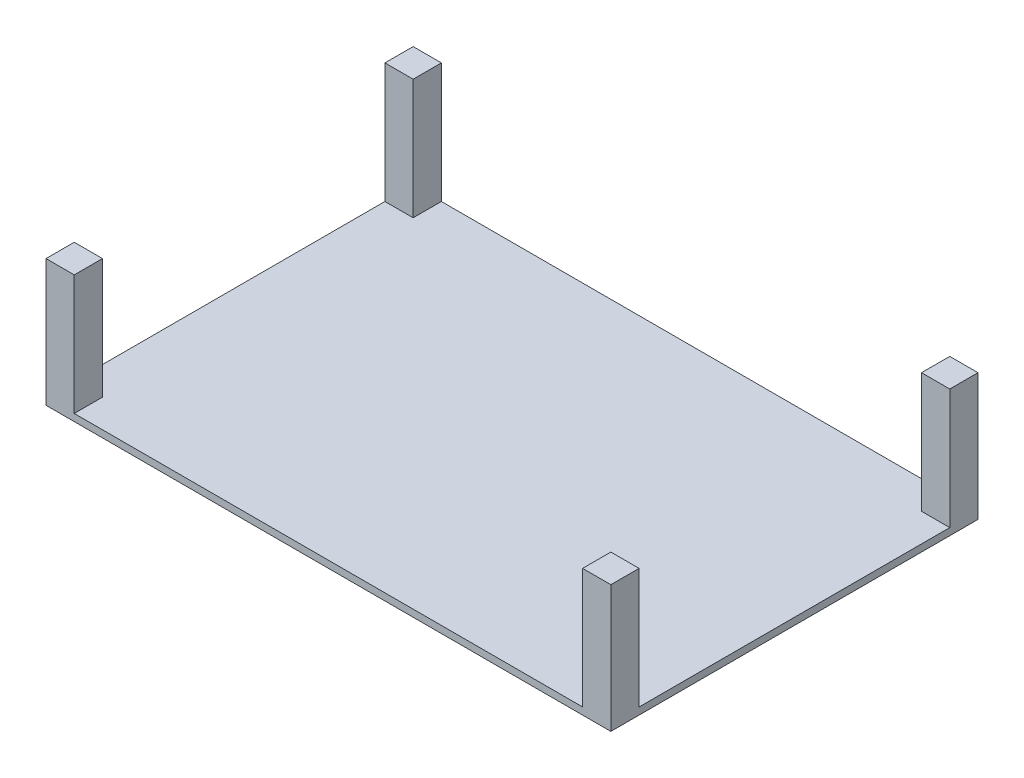
ISO-10303-21;
HEADER;
FILE_DESCRIPTION(('STEP AP214'),'2;1');
FILE_NAME('part.step','',(''),(''),'','','');
FILE_SCHEMA(('AUTOMOTIVE_DESIGN { 1 0 10303 214 1 1 1 1 }'));
ENDSEC;
DATA;
#1=APPLICATION_CONTEXT('core data for automotive mechanical design processes');
#2=APPLICATION_PROTOCOL_DEFINITION('international standard','automotive_design',2000,#1);
#3=PRODUCT_CONTEXT('',#1,'mechanical');
#4=PRODUCT('Part','Part','',(#3));
#5=PRODUCT_RELATED_PRODUCT_CATEGORY('part','',(#4));
#6=PRODUCT_DEFINITION_FORMATION('','',#4);
#7=PRODUCT_DEFINITION_CONTEXT('part definition',#1,'design');
#8=PRODUCT_DEFINITION('design','',#6,#7);
#9=PRODUCT_DEFINITION_SHAPE('','',#8);
#10=(LENGTH_UNIT() NAMED_UNIT(*) SI_UNIT(.MILLI.,.METRE.));
#11=(NAMED_UNIT(*) PLANE_ANGLE_UNIT() SI_UNIT($,.RADIAN.));
#12=(NAMED_UNIT(*) SI_UNIT($,.STERADIAN.) SOLID_ANGLE_UNIT());
#13=UNCERTAINTY_MEASURE_WITH_UNIT(LENGTH_MEASURE(1.E-05),#10,'distance_accuracy_value','');
#14=(GEOMETRIC_REPRESENTATION_CONTEXT(3) GLOBAL_UNCERTAINTY_ASSIGNED_CONTEXT((#13)) GLOBAL_UNIT_ASSIGNED_CONTEXT((#10,
#11,#12)) REPRESENTATION_CONTEXT('',''));
#15=CARTESIAN_POINT('',(0.,0.,0.));
#16=DIRECTION('',(0.,0.,1.));
#17=DIRECTION('',(1.,0.,0.));
#18=AXIS2_PLACEMENT_3D('',#15,#16,#17);
#19=CARTESIAN_POINT('',(0.,3.175,0.));
#20=DIRECTION('',(0.,-1.,0.));
#21=DIRECTION('',(0.,0.,-1.));
#22=AXIS2_PLACEMENT_3D('',#19,#20,#21);
#23=PLANE('',#22);
#24=DIRECTION('',(0.,0.,1.));
#25=VECTOR('',#24,1.);
#26=CARTESIAN_POINT('',(114.299999999999,3.175,-69.8499999999999));
#27=LINE('',#26,#25);
#28=CARTESIAN_POINT('',(114.299999999999,3.175,-82.5499999999999));
#29=VERTEX_POINT('',#28);
#30=CARTESIAN_POINT('',(114.299999999999,3.175,-69.8499999999999));
#31=VERTEX_POINT('',#30);
#32=EDGE_CURVE('E184',#29,#31,#27,.T.);
#33=ORIENTED_EDGE('',*,*,#32,.F.);
#34=DIRECTION('',(-1.,0.,0.));
#35=VECTOR('',#34,1.);
#36=CARTESIAN_POINT('',(-127.,3.175,-82.55));
#37=LINE('',#36,#35);
#38=CARTESIAN_POINT('',(-114.3,3.175,-82.55));
#39=VERTEX_POINT('',#38);
#40=EDGE_CURVE('E296',#29,#39,#37,.T.);
#41=ORIENTED_EDGE('',*,*,#40,.T.);
#42=DIRECTION('',(0.,0.,-1.));
#43=VECTOR('',#42,1.);
#44=CARTESIAN_POINT('',(-114.3,3.175,-69.8499999999999));
#45=LINE('',#44,#43);
#46=CARTESIAN_POINT('',(-114.3,3.175,-69.8499999999999));
#47=VERTEX_POINT('',#46);
#48=EDGE_CURVE('E191',#47,#39,#45,.T.);
#49=ORIENTED_EDGE('',*,*,#48,.F.);
#50=DIRECTION('',(1.,0.,0.));
#51=VECTOR('',#50,1.);
#52=CARTESIAN_POINT('',(-127.,3.175,-69.8499999999999));
#53=LINE('',#52,#51);
#54=CARTESIAN_POINT('',(-127.,3.175,-69.8499999999999));
#55=VERTEX_POINT('',#54);
#56=EDGE_CURVE('E186',#55,#47,#53,.T.);
#57=ORIENTED_EDGE('',*,*,#56,.F.);
#58=DIRECTION('',(0.,0.,1.));
#59=VECTOR('',#58,1.);
#60=CARTESIAN_POINT('',(-127.,3.175,82.55));
#61=LINE('',#60,#59);
#62=CARTESIAN_POINT('',(-127.,3.175,69.85));
#63=VERTEX_POINT('',#62);
#64=EDGE_CURVE('E300',#55,#63,#61,.T.);
#65=ORIENTED_EDGE('',*,*,#64,.T.);
#66=DIRECTION('',(-1.,0.,0.));
#67=VECTOR('',#66,1.);
#68=CARTESIAN_POINT('',(-127.,3.175,69.85));
#69=LINE('',#68,#67);
#70=CARTESIAN_POINT('',(-114.3,3.175,69.85));
#71=VERTEX_POINT('',#70);
#72=EDGE_CURVE('E266',#71,#63,#69,.T.);
#73=ORIENTED_EDGE('',*,*,#72,.F.);
#74=DIRECTION('',(0.,0.,-1.));
#75=VECTOR('',#74,1.);
#76=CARTESIAN_POINT('',(-114.3,3.175,82.55));
#77=LINE('',#76,#75);
#78=CARTESIAN_POINT('',(-114.3,3.175,82.55));
#79=VERTEX_POINT('',#78);
#80=EDGE_CURVE('E260',#79,#71,#77,.T.);
#81=ORIENTED_EDGE('',*,*,#80,.F.);
#82=DIRECTION('',(1.,0.,0.));
#83=VECTOR('',#82,1.);
#84=CARTESIAN_POINT('',(-127.,3.175,82.55));
#85=LINE('',#84,#83);
#86=CARTESIAN_POINT('',(114.299999999999,3.175,82.55));
#87=VERTEX_POINT('',#86);
#88=EDGE_CURVE('E303',#79,#87,#85,.T.);
#89=ORIENTED_EDGE('',*,*,#88,.T.);
#90=DIRECTION('',(0.,0.,1.));
#91=VECTOR('',#90,1.);
#92=CARTESIAN_POINT('',(114.299999999999,3.175,82.55));
#93=LINE('',#92,#91);
#94=CARTESIAN_POINT('',(114.299999999999,3.175,69.85));
#95=VERTEX_POINT('',#94);
#96=EDGE_CURVE('E226',#95,#87,#93,.T.);
#97=ORIENTED_EDGE('',*,*,#96,.F.);
#98=DIRECTION('',(-1.,0.,0.));
#99=VECTOR('',#98,1.);
#100=CARTESIAN_POINT('',(114.299999999999,3.175,69.85));
#101=LINE('',#100,#99);
#102=CARTESIAN_POINT('',(127.,3.175,69.85));
#103=VERTEX_POINT('',#102);
#104=EDGE_CURVE('E232',#103,#95,#101,.T.);
#105=ORIENTED_EDGE('',*,*,#104,.F.);
#106=DIRECTION('',(0.,0.,-1.));
#107=VECTOR('',#106,1.);
#108=CARTESIAN_POINT('',(127.,3.175,82.55));
#109=LINE('',#108,#107);
#110=CARTESIAN_POINT('',(127.,3.175,-69.8499999999999));
#111=VERTEX_POINT('',#110);
#112=EDGE_CURVE('E68',#103,#111,#109,.T.);
#113=ORIENTED_EDGE('',*,*,#112,.T.);
#114=DIRECTION('',(1.,0.,0.));
#115=VECTOR('',#114,1.);
#116=CARTESIAN_POINT('',(114.299999999999,3.175,-69.8499999999999));
#117=LINE('',#116,#115);
#118=EDGE_CURVE('E63',#31,#111,#117,.T.);
#119=ORIENTED_EDGE('',*,*,#118,.F.);
#120=EDGE_LOOP('',(#33,#41,#49,#57,#65,#73,#81,#89,#97,#105,#113,#119));
#121=FACE_BOUND('',#120,.T.);
#122=ADVANCED_FACE('F47',(#121),#23,.F.);
#123=CARTESIAN_POINT('',(127.,3.175,82.55));
#124=DIRECTION('',(-1.,0.,0.));
#125=DIRECTION('',(0.,0.,1.));
#126=AXIS2_PLACEMENT_3D('',#123,#124,#125);
#127=PLANE('',#126);
#128=DIRECTION('',(0.,0.,-1.));
#129=VECTOR('',#128,1.);
#130=CARTESIAN_POINT('',(127.,0.,82.55));
#131=LINE('',#130,#129);
#132=CARTESIAN_POINT('',(127.,0.,82.55));
#133=VERTEX_POINT('',#132);
#134=CARTESIAN_POINT('',(127.,0.,-82.55));
#135=VERTEX_POINT('',#134);
#136=EDGE_CURVE('E293',#133,#135,#131,.T.);
#137=ORIENTED_EDGE('',*,*,#136,.T.);
#138=DIRECTION('',(0.,-1.,0.));
#139=VECTOR('',#138,1.);
#140=CARTESIAN_POINT('',(127.,3.175,-82.55));
#141=LINE('',#140,#139);
#142=CARTESIAN_POINT('',(126.999999999999,57.15,-82.5499999999999));
#143=VERTEX_POINT('',#142);
#144=EDGE_CURVE('E11',#143,#135,#141,.T.);
#145=ORIENTED_EDGE('',*,*,#144,.F.);
#146=DIRECTION('',(0.,0.,-1.));
#147=VECTOR('',#146,1.);
#148=CARTESIAN_POINT('',(126.999999999999,57.15,-69.8499999999999));
#149=LINE('',#148,#147);
#150=CARTESIAN_POINT('',(126.999999999999,57.15,-69.8499999999999));
#151=VERTEX_POINT('',#150);
#152=EDGE_CURVE('E171',#151,#143,#149,.T.);
#153=ORIENTED_EDGE('',*,*,#152,.F.);
#154=DIRECTION('',(0.,-1.,0.));
#155=VECTOR('',#154,1.);
#156=CARTESIAN_POINT('',(126.999999999999,57.15,-69.8499999999999));
#157=LINE('',#156,#155);
#158=EDGE_CURVE('E166',#151,#111,#157,.T.);
#159=ORIENTED_EDGE('',*,*,#158,.T.);
#160=ORIENTED_EDGE('',*,*,#112,.F.);
#161=DIRECTION('',(0.,-1.,0.));
#162=VECTOR('',#161,1.);
#163=CARTESIAN_POINT('',(126.999999999999,57.15,69.85));
#164=LINE('',#163,#162);
#165=CARTESIAN_POINT('',(126.999999999999,57.15,69.85));
#166=VERTEX_POINT('',#165);
#167=EDGE_CURVE('E252',#166,#103,#164,.T.);
#168=ORIENTED_EDGE('',*,*,#167,.F.);
#169=DIRECTION('',(0.,0.,-1.));
#170=VECTOR('',#169,1.);
#171=CARTESIAN_POINT('',(126.999999999999,57.15,82.55));
#172=LINE('',#171,#170);
#173=CARTESIAN_POINT('',(126.999999999999,57.15,82.55));
#174=VERTEX_POINT('',#173);
#175=EDGE_CURVE('E236',#174,#166,#172,.T.);
#176=ORIENTED_EDGE('',*,*,#175,.F.);
#177=DIRECTION('',(0.,-1.,0.));
#178=VECTOR('',#177,1.);
#179=CARTESIAN_POINT('',(127.,3.175,82.55));
#180=LINE('',#179,#178);
#181=EDGE_CURVE('E306',#174,#133,#180,.T.);
#182=ORIENTED_EDGE('',*,*,#181,.T.);
#183=EDGE_LOOP('',(#137,#145,#153,#159,#160,#168,#176,#182));
#184=FACE_BOUND('',#183,.T.);
#185=ADVANCED_FACE('F49',(#184),#127,.F.);
#186=CARTESIAN_POINT('',(-127.,3.175,-82.55));
#187=DIRECTION('',(0.,0.,1.));
#188=DIRECTION('',(1.,0.,0.));
#189=AXIS2_PLACEMENT_3D('',#186,#187,#188);
#190=PLANE('',#189);
#191=DIRECTION('',(-1.,0.,0.));
#192=VECTOR('',#191,1.);
#193=CARTESIAN_POINT('',(-127.,0.,-82.55));
#194=LINE('',#193,#192);
#195=CARTESIAN_POINT('',(-127.,0.,-82.55));
#196=VERTEX_POINT('',#195);
#197=EDGE_CURVE('E310',#135,#196,#194,.T.);
#198=ORIENTED_EDGE('',*,*,#197,.T.);
#199=DIRECTION('',(0.,-1.,0.));
#200=VECTOR('',#199,1.);
#201=CARTESIAN_POINT('',(-127.,3.175,-82.55));
#202=LINE('',#201,#200);
#203=CARTESIAN_POINT('',(-127.,57.15,-82.5499999999999));
#204=VERTEX_POINT('',#203);
#205=EDGE_CURVE('E56',#204,#196,#202,.T.);
#206=ORIENTED_EDGE('',*,*,#205,.F.);
#207=DIRECTION('',(-1.,0.,0.));
#208=VECTOR('',#207,1.);
#209=CARTESIAN_POINT('',(-127.,57.15,-82.5499999999999));
#210=LINE('',#209,#208);
#211=CARTESIAN_POINT('',(-114.3,57.15,-82.5499999999999));
#212=VERTEX_POINT('',#211);
#213=EDGE_CURVE('E207',#212,#204,#210,.T.);
#214=ORIENTED_EDGE('',*,*,#213,.F.);
#215=DIRECTION('',(0.,-1.,0.));
#216=VECTOR('',#215,1.);
#217=CARTESIAN_POINT('',(-114.3,57.15,-82.5499999999999));
#218=LINE('',#217,#216);
#219=EDGE_CURVE('E210',#212,#39,#218,.T.);
#220=ORIENTED_EDGE('',*,*,#219,.T.);
#221=ORIENTED_EDGE('',*,*,#40,.F.);
#222=DIRECTION('',(0.,-1.,0.));
#223=VECTOR('',#222,1.);
#224=CARTESIAN_POINT('',(114.299999999999,57.15,-82.5499999999999));
#225=LINE('',#224,#223);
#226=CARTESIAN_POINT('',(114.299999999999,57.15,-82.5499999999999));
#227=VERTEX_POINT('',#226);
#228=EDGE_CURVE('E193',#227,#29,#225,.T.);
#229=ORIENTED_EDGE('',*,*,#228,.F.);
#230=DIRECTION('',(-1.,0.,0.));
#231=VECTOR('',#230,1.);
#232=CARTESIAN_POINT('',(114.299999999999,57.15,-82.5499999999999));
#233=LINE('',#232,#231);
#234=EDGE_CURVE('E177',#143,#227,#233,.T.);
#235=ORIENTED_EDGE('',*,*,#234,.F.);
#236=ORIENTED_EDGE('',*,*,#144,.T.);
#237=EDGE_LOOP('',(#198,#206,#214,#220,#221,#229,#235,#236));
#238=FACE_BOUND('',#237,.T.);
#239=ADVANCED_FACE('F371',(#238),#190,.F.);
#240=CARTESIAN_POINT('',(-127.,3.175,82.55));
#241=DIRECTION('',(1.,0.,0.));
#242=DIRECTION('',(0.,0.,-1.));
#243=AXIS2_PLACEMENT_3D('',#240,#241,#242);
#244=PLANE('',#243);
#245=DIRECTION('',(0.,0.,1.));
#246=VECTOR('',#245,1.);
#247=CARTESIAN_POINT('',(-127.,0.,82.55));
#248=LINE('',#247,#246);
#249=CARTESIAN_POINT('',(-127.,0.,82.55));
#250=VERTEX_POINT('',#249);
#251=EDGE_CURVE('E313',#196,#250,#248,.T.);
#252=ORIENTED_EDGE('',*,*,#251,.T.);
#253=DIRECTION('',(0.,-1.,0.));
#254=VECTOR('',#253,1.);
#255=CARTESIAN_POINT('',(-127.,3.175,82.55));
#256=LINE('',#255,#254);
#257=CARTESIAN_POINT('',(-127.,57.15,82.55));
#258=VERTEX_POINT('',#257);
#259=EDGE_CURVE('E321',#258,#250,#256,.T.);
#260=ORIENTED_EDGE('',*,*,#259,.F.);
#261=DIRECTION('',(0.,0.,1.));
#262=VECTOR('',#261,1.);
#263=CARTESIAN_POINT('',(-127.,57.15,82.55));
#264=LINE('',#263,#262);
#265=CARTESIAN_POINT('',(-127.,57.15,69.85));
#266=VERTEX_POINT('',#265);
#267=EDGE_CURVE('E261',#266,#258,#264,.T.);
#268=ORIENTED_EDGE('',*,*,#267,.F.);
#269=DIRECTION('',(0.,-1.,0.));
#270=VECTOR('',#269,1.);
#271=CARTESIAN_POINT('',(-127.,57.15,69.85));
#272=LINE('',#271,#270);
#273=EDGE_CURVE('E275',#266,#63,#272,.T.);
#274=ORIENTED_EDGE('',*,*,#273,.T.);
#275=ORIENTED_EDGE('',*,*,#64,.F.);
#276=DIRECTION('',(0.,-1.,0.));
#277=VECTOR('',#276,1.);
#278=CARTESIAN_POINT('',(-127.,57.15,-69.8499999999999));
#279=LINE('',#278,#277);
#280=CARTESIAN_POINT('',(-127.,57.15,-69.8499999999999));
#281=VERTEX_POINT('',#280);
#282=EDGE_CURVE('E222',#281,#55,#279,.T.);
#283=ORIENTED_EDGE('',*,*,#282,.F.);
#284=DIRECTION('',(0.,0.,1.));
#285=VECTOR('',#284,1.);
#286=CARTESIAN_POINT('',(-127.,57.15,-69.8499999999999));
#287=LINE('',#286,#285);
#288=EDGE_CURVE('E197',#204,#281,#287,.T.);
#289=ORIENTED_EDGE('',*,*,#288,.F.);
#290=ORIENTED_EDGE('',*,*,#205,.T.);
#291=EDGE_LOOP('',(#252,#260,#268,#274,#275,#283,#289,#290));
#292=FACE_BOUND('',#291,.T.);
#293=ADVANCED_FACE('F329',(#292),#244,.F.);
#294=CARTESIAN_POINT('',(-127.,3.175,82.55));
#295=DIRECTION('',(0.,0.,-1.));
#296=DIRECTION('',(-1.,0.,0.));
#297=AXIS2_PLACEMENT_3D('',#294,#295,#296);
#298=PLANE('',#297);
#299=DIRECTION('',(1.,0.,0.));
#300=VECTOR('',#299,1.);
#301=CARTESIAN_POINT('',(-127.,0.,82.55));
#302=LINE('',#301,#300);
#303=EDGE_CURVE('E297',#250,#133,#302,.T.);
#304=ORIENTED_EDGE('',*,*,#303,.T.);
#305=ORIENTED_EDGE('',*,*,#181,.F.);
#306=DIRECTION('',(1.,0.,0.));
#307=VECTOR('',#306,1.);
#308=CARTESIAN_POINT('',(114.299999999999,57.15,82.55));
#309=LINE('',#308,#307);
#310=CARTESIAN_POINT('',(114.299999999999,57.15,82.55));
#311=VERTEX_POINT('',#310);
#312=EDGE_CURVE('E231',#311,#174,#309,.T.);
#313=ORIENTED_EDGE('',*,*,#312,.F.);
#314=DIRECTION('',(0.,-1.,0.));
#315=VECTOR('',#314,1.);
#316=CARTESIAN_POINT('',(114.299999999999,57.15,82.55));
#317=LINE('',#316,#315);
#318=EDGE_CURVE('E256',#311,#87,#317,.T.);
#319=ORIENTED_EDGE('',*,*,#318,.T.);
#320=ORIENTED_EDGE('',*,*,#88,.F.);
#321=DIRECTION('',(0.,-1.,0.));
#322=VECTOR('',#321,1.);
#323=CARTESIAN_POINT('',(-114.3,57.15,82.55));
#324=LINE('',#323,#322);
#325=CARTESIAN_POINT('',(-114.3,57.15,82.55));
#326=VERTEX_POINT('',#325);
#327=EDGE_CURVE('E289',#326,#79,#324,.T.);
#328=ORIENTED_EDGE('',*,*,#327,.F.);
#329=DIRECTION('',(1.,0.,0.));
#330=VECTOR('',#329,1.);
#331=CARTESIAN_POINT('',(-127.,57.15,82.55));
#332=LINE('',#331,#330);
#333=EDGE_CURVE('E265',#258,#326,#332,.T.);
#334=ORIENTED_EDGE('',*,*,#333,.F.);
#335=ORIENTED_EDGE('',*,*,#259,.T.);
#336=EDGE_LOOP('',(#304,#305,#313,#319,#320,#328,#334,#335));
#337=FACE_BOUND('',#336,.T.);
#338=ADVANCED_FACE('F338',(#337),#298,.F.);
#339=CARTESIAN_POINT('',(0.,0.,0.));
#340=DIRECTION('',(0.,-1.,0.));
#341=DIRECTION('',(0.,0.,-1.));
#342=AXIS2_PLACEMENT_3D('',#339,#340,#341);
#343=PLANE('',#342);
#344=ORIENTED_EDGE('',*,*,#136,.F.);
#345=ORIENTED_EDGE('',*,*,#303,.F.);
#346=ORIENTED_EDGE('',*,*,#251,.F.);
#347=ORIENTED_EDGE('',*,*,#197,.F.);
#348=EDGE_LOOP('',(#344,#345,#346,#347));
#349=FACE_BOUND('',#348,.T.);
#350=ADVANCED_FACE('F336',(#349),#343,.T.);
#351=CARTESIAN_POINT('',(-114.3,57.15,82.55));
#352=DIRECTION('',(-1.,0.,0.));
#353=DIRECTION('',(0.,0.,1.));
#354=AXIS2_PLACEMENT_3D('',#351,#352,#353);
#355=PLANE('',#354);
#356=ORIENTED_EDGE('',*,*,#80,.T.);
#357=DIRECTION('',(0.,-1.,0.));
#358=VECTOR('',#357,1.);
#359=CARTESIAN_POINT('',(-114.3,57.15,69.85));
#360=LINE('',#359,#358);
#361=CARTESIAN_POINT('',(-114.3,57.15,69.85));
#362=VERTEX_POINT('',#361);
#363=EDGE_CURVE('E285',#362,#71,#360,.T.);
#364=ORIENTED_EDGE('',*,*,#363,.F.);
#365=DIRECTION('',(0.,0.,-1.));
#366=VECTOR('',#365,1.);
#367=CARTESIAN_POINT('',(-114.3,57.15,82.55));
#368=LINE('',#367,#366);
#369=EDGE_CURVE('E269',#326,#362,#368,.T.);
#370=ORIENTED_EDGE('',*,*,#369,.F.);
#371=ORIENTED_EDGE('',*,*,#327,.T.);
#372=EDGE_LOOP('',(#356,#364,#370,#371));
#373=FACE_BOUND('',#372,.T.);
#374=ADVANCED_FACE('F374',(#373),#355,.F.);
#375=CARTESIAN_POINT('',(-127.,57.15,69.85));
#376=DIRECTION('',(0.,0.,1.));
#377=DIRECTION('',(1.,0.,0.));
#378=AXIS2_PLACEMENT_3D('',#375,#376,#377);
#379=PLANE('',#378);
#380=ORIENTED_EDGE('',*,*,#72,.T.);
#381=ORIENTED_EDGE('',*,*,#273,.F.);
#382=DIRECTION('',(-1.,0.,0.));
#383=VECTOR('',#382,1.);
#384=CARTESIAN_POINT('',(-127.,57.15,69.85));
#385=LINE('',#384,#383);
#386=EDGE_CURVE('E272',#362,#266,#385,.T.);
#387=ORIENTED_EDGE('',*,*,#386,.F.);
#388=ORIENTED_EDGE('',*,*,#363,.T.);
#389=EDGE_LOOP('',(#380,#381,#387,#388));
#390=FACE_BOUND('',#389,.T.);
#391=ADVANCED_FACE('F402',(#390),#379,.F.);
#392=CARTESIAN_POINT('',(0.,57.15,0.));
#393=DIRECTION('',(0.,-1.,0.));
#394=DIRECTION('',(0.,0.,-1.));
#395=AXIS2_PLACEMENT_3D('',#392,#393,#394);
#396=PLANE('',#395);
#397=ORIENTED_EDGE('',*,*,#267,.T.);
#398=ORIENTED_EDGE('',*,*,#333,.T.);
#399=ORIENTED_EDGE('',*,*,#369,.T.);
#400=ORIENTED_EDGE('',*,*,#386,.T.);
#401=EDGE_LOOP('',(#397,#398,#399,#400));
#402=FACE_BOUND('',#401,.T.);
#403=ADVANCED_FACE('F363',(#402),#396,.F.);
#404=CARTESIAN_POINT('',(114.299999999999,57.15,82.55));
#405=DIRECTION('',(1.,0.,0.));
#406=DIRECTION('',(0.,0.,-1.));
#407=AXIS2_PLACEMENT_3D('',#404,#405,#406);
#408=PLANE('',#407);
#409=ORIENTED_EDGE('',*,*,#96,.T.);
#410=ORIENTED_EDGE('',*,*,#318,.F.);
#411=DIRECTION('',(0.,0.,1.));
#412=VECTOR('',#411,1.);
#413=CARTESIAN_POINT('',(114.299999999999,57.15,82.55));
#414=LINE('',#413,#412);
#415=CARTESIAN_POINT('',(114.299999999999,57.15,69.85));
#416=VERTEX_POINT('',#415);
#417=EDGE_CURVE('E227',#416,#311,#414,.T.);
#418=ORIENTED_EDGE('',*,*,#417,.F.);
#419=DIRECTION('',(0.,-1.,0.));
#420=VECTOR('',#419,1.);
#421=CARTESIAN_POINT('',(114.299999999999,57.15,69.85));
#422=LINE('',#421,#420);
#423=EDGE_CURVE('E242',#416,#95,#422,.T.);
#424=ORIENTED_EDGE('',*,*,#423,.T.);
#425=EDGE_LOOP('',(#409,#410,#418,#424));
#426=FACE_BOUND('',#425,.T.);
#427=ADVANCED_FACE('F352',(#426),#408,.F.);
#428=CARTESIAN_POINT('',(114.299999999999,57.15,69.85));
#429=DIRECTION('',(0.,0.,1.));
#430=DIRECTION('',(1.,0.,0.));
#431=AXIS2_PLACEMENT_3D('',#428,#429,#430);
#432=PLANE('',#431);
#433=ORIENTED_EDGE('',*,*,#104,.T.);
#434=ORIENTED_EDGE('',*,*,#423,.F.);
#435=DIRECTION('',(-1.,0.,0.));
#436=VECTOR('',#435,1.);
#437=CARTESIAN_POINT('',(114.299999999999,57.15,69.85));
#438=LINE('',#437,#436);
#439=EDGE_CURVE('E239',#166,#416,#438,.T.);
#440=ORIENTED_EDGE('',*,*,#439,.F.);
#441=ORIENTED_EDGE('',*,*,#167,.T.);
#442=EDGE_LOOP('',(#433,#434,#440,#441));
#443=FACE_BOUND('',#442,.T.);
#444=ADVANCED_FACE('F354',(#443),#432,.F.);
#445=CARTESIAN_POINT('',(241.299999999999,57.15,0.));
#446=DIRECTION('',(0.,-1.,0.));
#447=DIRECTION('',(0.,0.,-1.));
#448=AXIS2_PLACEMENT_3D('',#445,#446,#447);
#449=PLANE('',#448);
#450=ORIENTED_EDGE('',*,*,#417,.T.);
#451=ORIENTED_EDGE('',*,*,#312,.T.);
#452=ORIENTED_EDGE('',*,*,#175,.T.);
#453=ORIENTED_EDGE('',*,*,#439,.T.);
#454=EDGE_LOOP('',(#450,#451,#452,#453));
#455=FACE_BOUND('',#454,.T.);
#456=ADVANCED_FACE('F345',(#455),#449,.F.);
#457=CARTESIAN_POINT('',(-127.,57.15,-69.8499999999999));
#458=DIRECTION('',(0.,0.,-1.));
#459=DIRECTION('',(-1.,0.,0.));
#460=AXIS2_PLACEMENT_3D('',#457,#458,#459);
#461=PLANE('',#460);
#462=ORIENTED_EDGE('',*,*,#56,.T.);
#463=DIRECTION('',(0.,-1.,0.));
#464=VECTOR('',#463,1.);
#465=CARTESIAN_POINT('',(-114.3,57.15,-69.8499999999999));
#466=LINE('',#465,#464);
#467=CARTESIAN_POINT('',(-114.3,57.15,-69.8499999999999));
#468=VERTEX_POINT('',#467);
#469=EDGE_CURVE('E218',#468,#47,#466,.T.);
#470=ORIENTED_EDGE('',*,*,#469,.F.);
#471=DIRECTION('',(1.,0.,0.));
#472=VECTOR('',#471,1.);
#473=CARTESIAN_POINT('',(-127.,57.15,-69.8499999999999));
#474=LINE('',#473,#472);
#475=EDGE_CURVE('E201',#281,#468,#474,.T.);
#476=ORIENTED_EDGE('',*,*,#475,.F.);
#477=ORIENTED_EDGE('',*,*,#282,.T.);
#478=EDGE_LOOP('',(#462,#470,#476,#477));
#479=FACE_BOUND('',#478,.T.);
#480=ADVANCED_FACE('F361',(#479),#461,.F.);
#481=CARTESIAN_POINT('',(-114.3,57.15,-69.8499999999999));
#482=DIRECTION('',(-1.,0.,0.));
#483=DIRECTION('',(0.,0.,1.));
#484=AXIS2_PLACEMENT_3D('',#481,#482,#483);
#485=PLANE('',#484);
#486=ORIENTED_EDGE('',*,*,#48,.T.);
#487=ORIENTED_EDGE('',*,*,#219,.F.);
#488=DIRECTION('',(0.,0.,-1.));
#489=VECTOR('',#488,1.);
#490=CARTESIAN_POINT('',(-114.3,57.15,-69.8499999999999));
#491=LINE('',#490,#489);
#492=EDGE_CURVE('E204',#468,#212,#491,.T.);
#493=ORIENTED_EDGE('',*,*,#492,.F.);
#494=ORIENTED_EDGE('',*,*,#469,.T.);
#495=EDGE_LOOP('',(#486,#487,#493,#494));
#496=FACE_BOUND('',#495,.T.);
#497=ADVANCED_FACE('F396',(#496),#485,.F.);
#498=CARTESIAN_POINT('',(0.,57.15,-152.4));
#499=DIRECTION('',(0.,-1.,0.));
#500=DIRECTION('',(0.,0.,-1.));
#501=AXIS2_PLACEMENT_3D('',#498,#499,#500);
#502=PLANE('',#501);
#503=ORIENTED_EDGE('',*,*,#288,.T.);
#504=ORIENTED_EDGE('',*,*,#475,.T.);
#505=ORIENTED_EDGE('',*,*,#492,.T.);
#506=ORIENTED_EDGE('',*,*,#213,.T.);
#507=EDGE_LOOP('',(#503,#504,#505,#506));
#508=FACE_BOUND('',#507,.T.);
#509=ADVANCED_FACE('F491',(#508),#502,.F.);
#510=CARTESIAN_POINT('',(114.299999999999,57.15,-69.8499999999999));
#511=DIRECTION('',(1.,0.,0.));
#512=DIRECTION('',(0.,0.,-1.));
#513=AXIS2_PLACEMENT_3D('',#510,#511,#512);
#514=PLANE('',#513);
#515=ORIENTED_EDGE('',*,*,#32,.T.);
#516=DIRECTION('',(0.,-1.,0.));
#517=VECTOR('',#516,1.);
#518=CARTESIAN_POINT('',(114.299999999999,57.15,-69.8499999999999));
#519=LINE('',#518,#517);
#520=CARTESIAN_POINT('',(114.299999999999,57.15,-69.8499999999999));
#521=VERTEX_POINT('',#520);
#522=EDGE_CURVE('E163',#521,#31,#519,.T.);
#523=ORIENTED_EDGE('',*,*,#522,.F.);
#524=DIRECTION('',(0.,0.,1.));
#525=VECTOR('',#524,1.);
#526=CARTESIAN_POINT('',(114.299999999999,57.15,-69.8499999999999));
#527=LINE('',#526,#525);
#528=EDGE_CURVE('E172',#227,#521,#527,.T.);
#529=ORIENTED_EDGE('',*,*,#528,.F.);
#530=ORIENTED_EDGE('',*,*,#228,.T.);
#531=EDGE_LOOP('',(#515,#523,#529,#530));
#532=FACE_BOUND('',#531,.T.);
#533=ADVANCED_FACE('F183',(#532),#514,.F.);
#534=CARTESIAN_POINT('',(114.299999999999,57.15,-69.8499999999999));
#535=DIRECTION('',(0.,0.,-1.));
#536=DIRECTION('',(-1.,0.,0.));
#537=AXIS2_PLACEMENT_3D('',#534,#535,#536);
#538=PLANE('',#537);
#539=ORIENTED_EDGE('',*,*,#118,.T.);
#540=ORIENTED_EDGE('',*,*,#158,.F.);
#541=DIRECTION('',(1.,0.,0.));
#542=VECTOR('',#541,1.);
#543=CARTESIAN_POINT('',(114.299999999999,57.15,-69.8499999999999));
#544=LINE('',#543,#542);
#545=EDGE_CURVE('E159',#521,#151,#544,.T.);
#546=ORIENTED_EDGE('',*,*,#545,.F.);
#547=ORIENTED_EDGE('',*,*,#522,.T.);
#548=EDGE_LOOP('',(#539,#540,#546,#547));
#549=FACE_BOUND('',#548,.T.);
#550=ADVANCED_FACE('F161',(#549),#538,.F.);
#551=CARTESIAN_POINT('',(241.299999999999,57.15,-152.4));
#552=DIRECTION('',(0.,-1.,0.));
#553=DIRECTION('',(0.,0.,-1.));
#554=AXIS2_PLACEMENT_3D('',#551,#552,#553);
#555=PLANE('',#554);
#556=ORIENTED_EDGE('',*,*,#528,.T.);
#557=ORIENTED_EDGE('',*,*,#545,.T.);
#558=ORIENTED_EDGE('',*,*,#152,.T.);
#559=ORIENTED_EDGE('',*,*,#234,.T.);
#560=EDGE_LOOP('',(#556,#557,#558,#559));
#561=FACE_BOUND('',#560,.T.);
#562=ADVANCED_FACE('F175',(#561),#555,.F.);
#563=CLOSED_SHELL('',(#122,#185,#239,#293,#338,#350,#374,#391,#403,#427,#444,#456,#480,#497,
#509,#533,#550,#562));
#564=MANIFOLD_SOLID_BREP('B2',#563);
#565=ADVANCED_BREP_SHAPE_REPRESENTATION('',(#18,#564),#14);
#566=SHAPE_DEFINITION_REPRESENTATION(#9,#565);
ENDSEC;
END-ISO-10303-21;
